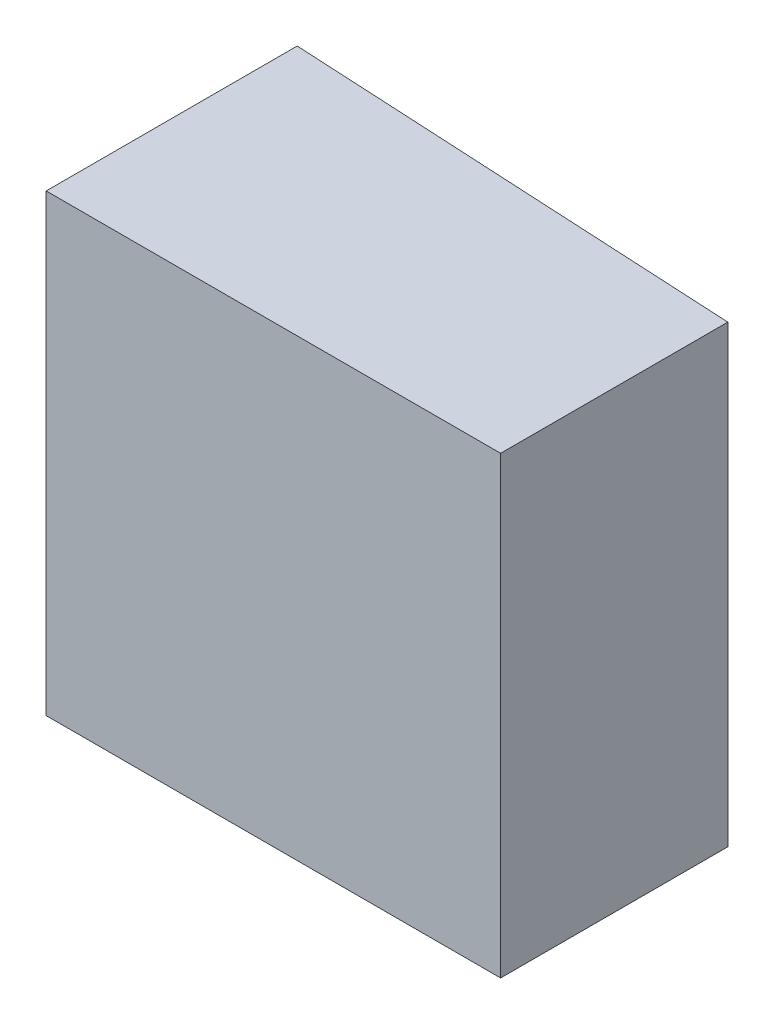
ISO-10303-21;
HEADER;
FILE_DESCRIPTION(('STEP AP214'),'2;1');
FILE_NAME('part.step','',(''),(''),'','','');
FILE_SCHEMA(('AUTOMOTIVE_DESIGN { 1 0 10303 214 1 1 1 1 }'));
ENDSEC;
DATA;
#1=APPLICATION_CONTEXT('core data for automotive mechanical design processes');
#2=APPLICATION_PROTOCOL_DEFINITION('international standard','automotive_design',2000,#1);
#3=PRODUCT_CONTEXT('',#1,'mechanical');
#4=PRODUCT('Part','Part','',(#3));
#5=PRODUCT_RELATED_PRODUCT_CATEGORY('part','',(#4));
#6=PRODUCT_DEFINITION_FORMATION('','',#4);
#7=PRODUCT_DEFINITION_CONTEXT('part definition',#1,'design');
#8=PRODUCT_DEFINITION('design','',#6,#7);
#9=PRODUCT_DEFINITION_SHAPE('','',#8);
#10=(LENGTH_UNIT() NAMED_UNIT(*) SI_UNIT(.MILLI.,.METRE.));
#11=(NAMED_UNIT(*) PLANE_ANGLE_UNIT() SI_UNIT($,.RADIAN.));
#12=(NAMED_UNIT(*) SI_UNIT($,.STERADIAN.) SOLID_ANGLE_UNIT());
#13=UNCERTAINTY_MEASURE_WITH_UNIT(LENGTH_MEASURE(1.E-05),#10,'distance_accuracy_value','');
#14=(GEOMETRIC_REPRESENTATION_CONTEXT(3) GLOBAL_UNCERTAINTY_ASSIGNED_CONTEXT((#13)) GLOBAL_UNIT_ASSIGNED_CONTEXT((#10,
#11,#12)) REPRESENTATION_CONTEXT('',''));
#15=CARTESIAN_POINT('',(0.,0.,0.));
#16=DIRECTION('',(0.,0.,1.));
#17=DIRECTION('',(1.,0.,0.));
#18=AXIS2_PLACEMENT_3D('',#15,#16,#17);
#19=CARTESIAN_POINT('',(0.,0.,10.));
#20=DIRECTION('',(1.,0.,0.));
#21=DIRECTION('',(0.,0.,-1.));
#22=AXIS2_PLACEMENT_3D('',#19,#20,#21);
#23=PLANE('',#22);
#24=DIRECTION('',(0.,-1.,0.));
#25=VECTOR('',#24,1.);
#26=CARTESIAN_POINT('',(0.,0.,-1.04815558566082));
#27=LINE('',#26,#25);
#28=CARTESIAN_POINT('',(0.,20.,-1.04815558566082));
#29=VERTEX_POINT('',#28);
#30=CARTESIAN_POINT('',(0.,0.,-1.04815558566082));
#31=VERTEX_POINT('',#30);
#32=EDGE_CURVE('E81',#29,#31,#27,.T.);
#33=ORIENTED_EDGE('',*,*,#32,.T.);
#34=DIRECTION('',(0.,0.,-1.));
#35=VECTOR('',#34,1.);
#36=CARTESIAN_POINT('',(0.,0.,10.));
#37=LINE('',#36,#35);
#38=CARTESIAN_POINT('',(0.,0.,10.));
#39=VERTEX_POINT('',#38);
#40=EDGE_CURVE('E11',#39,#31,#37,.T.);
#41=ORIENTED_EDGE('',*,*,#40,.F.);
#42=DIRECTION('',(0.,-1.,0.));
#43=VECTOR('',#42,1.);
#44=CARTESIAN_POINT('',(0.,0.,10.));
#45=LINE('',#44,#43);
#46=CARTESIAN_POINT('',(0.,20.,10.));
#47=VERTEX_POINT('',#46);
#48=EDGE_CURVE('E107',#47,#39,#45,.T.);
#49=ORIENTED_EDGE('',*,*,#48,.F.);
#50=DIRECTION('',(0.,0.,-1.));
#51=VECTOR('',#50,1.);
#52=CARTESIAN_POINT('',(0.,20.,10.));
#53=LINE('',#52,#51);
#54=EDGE_CURVE('E92',#47,#29,#53,.T.);
#55=ORIENTED_EDGE('',*,*,#54,.T.);
#56=EDGE_LOOP('',(#33,#41,#49,#55));
#57=FACE_BOUND('',#56,.T.);
#58=ADVANCED_FACE('F43',(#57),#23,.F.);
#59=CARTESIAN_POINT('',(0.,0.,10.));
#60=DIRECTION('',(0.,1.,0.));
#61=DIRECTION('',(0.,0.,1.));
#62=AXIS2_PLACEMENT_3D('',#59,#60,#61);
#63=PLANE('',#62);
#64=DIRECTION('',(0.998629534754574,0.,0.0523359562429438));
#65=VECTOR('',#64,1.);
#66=CARTESIAN_POINT('',(20.,0.,0.));
#67=LINE('',#66,#65);
#68=CARTESIAN_POINT('',(20.,0.,0.));
#69=VERTEX_POINT('',#68);
#70=EDGE_CURVE('E77',#31,#69,#67,.T.);
#71=ORIENTED_EDGE('',*,*,#70,.T.);
#72=DIRECTION('',(0.,0.,-1.));
#73=VECTOR('',#72,1.);
#74=CARTESIAN_POINT('',(20.,0.,10.));
#75=LINE('',#74,#73);
#76=CARTESIAN_POINT('',(20.,0.,10.));
#77=VERTEX_POINT('',#76);
#78=EDGE_CURVE('E52',#77,#69,#75,.T.);
#79=ORIENTED_EDGE('',*,*,#78,.F.);
#80=DIRECTION('',(1.,0.,0.));
#81=VECTOR('',#80,1.);
#82=CARTESIAN_POINT('',(0.,0.,10.));
#83=LINE('',#82,#81);
#84=EDGE_CURVE('E93',#39,#77,#83,.T.);
#85=ORIENTED_EDGE('',*,*,#84,.F.);
#86=ORIENTED_EDGE('',*,*,#40,.T.);
#87=EDGE_LOOP('',(#71,#79,#85,#86));
#88=FACE_BOUND('',#87,.T.);
#89=ADVANCED_FACE('F86',(#88),#63,.F.);
#90=CARTESIAN_POINT('',(20.,0.,10.));
#91=DIRECTION('',(-1.,0.,0.));
#92=DIRECTION('',(0.,0.,1.));
#93=AXIS2_PLACEMENT_3D('',#90,#91,#92);
#94=PLANE('',#93);
#95=DIRECTION('',(0.,1.,0.));
#96=VECTOR('',#95,1.);
#97=CARTESIAN_POINT('',(20.,0.,0.));
#98=LINE('',#97,#96);
#99=CARTESIAN_POINT('',(20.,20.,0.));
#100=VERTEX_POINT('',#99);
#101=EDGE_CURVE('E85',#69,#100,#98,.T.);
#102=ORIENTED_EDGE('',*,*,#101,.T.);
#103=DIRECTION('',(0.,0.,-1.));
#104=VECTOR('',#103,1.);
#105=CARTESIAN_POINT('',(20.,20.,10.));
#106=LINE('',#105,#104);
#107=CARTESIAN_POINT('',(20.,20.,10.));
#108=VERTEX_POINT('',#107);
#109=EDGE_CURVE('E97',#108,#100,#106,.T.);
#110=ORIENTED_EDGE('',*,*,#109,.F.);
#111=DIRECTION('',(0.,1.,0.));
#112=VECTOR('',#111,1.);
#113=CARTESIAN_POINT('',(20.,0.,10.));
#114=LINE('',#113,#112);
#115=EDGE_CURVE('E104',#77,#108,#114,.T.);
#116=ORIENTED_EDGE('',*,*,#115,.F.);
#117=ORIENTED_EDGE('',*,*,#78,.T.);
#118=EDGE_LOOP('',(#102,#110,#116,#117));
#119=FACE_BOUND('',#118,.T.);
#120=ADVANCED_FACE('F119',(#119),#94,.F.);
#121=CARTESIAN_POINT('',(0.,20.,10.));
#122=DIRECTION('',(0.,-1.,0.));
#123=DIRECTION('',(0.,0.,-1.));
#124=AXIS2_PLACEMENT_3D('',#121,#122,#123);
#125=PLANE('',#124);
#126=DIRECTION('',(-0.998629534754574,0.,-0.0523359562429438));
#127=VECTOR('',#126,1.);
#128=CARTESIAN_POINT('',(20.,20.,0.));
#129=LINE('',#128,#127);
#130=EDGE_CURVE('E50',#100,#29,#129,.T.);
#131=ORIENTED_EDGE('',*,*,#130,.T.);
#132=ORIENTED_EDGE('',*,*,#54,.F.);
#133=DIRECTION('',(-1.,0.,0.));
#134=VECTOR('',#133,1.);
#135=CARTESIAN_POINT('',(0.,20.,10.));
#136=LINE('',#135,#134);
#137=EDGE_CURVE('E64',#108,#47,#136,.T.);
#138=ORIENTED_EDGE('',*,*,#137,.F.);
#139=ORIENTED_EDGE('',*,*,#109,.T.);
#140=EDGE_LOOP('',(#131,#132,#138,#139));
#141=FACE_BOUND('',#140,.T.);
#142=ADVANCED_FACE('F112',(#141),#125,.F.);
#143=CARTESIAN_POINT('',(0.,0.,10.));
#144=DIRECTION('',(0.,0.,-1.));
#145=DIRECTION('',(-1.,0.,0.));
#146=AXIS2_PLACEMENT_3D('',#143,#144,#145);
#147=PLANE('',#146);
#148=ORIENTED_EDGE('',*,*,#48,.T.);
#149=ORIENTED_EDGE('',*,*,#84,.T.);
#150=ORIENTED_EDGE('',*,*,#115,.T.);
#151=ORIENTED_EDGE('',*,*,#137,.T.);
#152=EDGE_LOOP('',(#148,#149,#150,#151));
#153=FACE_BOUND('',#152,.T.);
#154=ADVANCED_FACE('F111',(#153),#147,.F.);
#155=CARTESIAN_POINT('',(20.,0.,0.));
#156=DIRECTION('',(0.0523359562429438,0.,-0.998629534754574));
#157=DIRECTION('',(0.998629534754574,0.,0.0523359562429438));
#158=AXIS2_PLACEMENT_3D('',#155,#156,#157);
#159=PLANE('',#158);
#160=ORIENTED_EDGE('',*,*,#32,.F.);
#161=ORIENTED_EDGE('',*,*,#130,.F.);
#162=ORIENTED_EDGE('',*,*,#101,.F.);
#163=ORIENTED_EDGE('',*,*,#70,.F.);
#164=EDGE_LOOP('',(#160,#161,#162,#163));
#165=FACE_BOUND('',#164,.T.);
#166=ADVANCED_FACE('F44',(#165),#159,.T.);
#167=CLOSED_SHELL('',(#58,#89,#120,#142,#154,#166));
#168=MANIFOLD_SOLID_BREP('B2',#167);
#169=ADVANCED_BREP_SHAPE_REPRESENTATION('',(#18,#168),#14);
#170=SHAPE_DEFINITION_REPRESENTATION(#9,#169);
ENDSEC;
END-ISO-10303-21;
